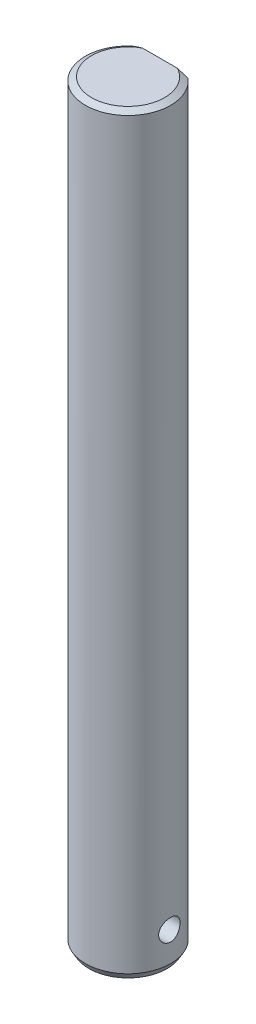
ISO-10303-21;
HEADER;
FILE_DESCRIPTION(('STEP AP214'),'2;1');
FILE_NAME('part.step','',(''),(''),'','','');
FILE_SCHEMA(('AUTOMOTIVE_DESIGN { 1 0 10303 214 1 1 1 1 }'));
ENDSEC;
DATA;
#1=APPLICATION_CONTEXT('core data for automotive mechanical design processes');
#2=APPLICATION_PROTOCOL_DEFINITION('international standard','automotive_design',2000,#1);
#3=PRODUCT_CONTEXT('',#1,'mechanical');
#4=PRODUCT('Part','Part','',(#3));
#5=PRODUCT_RELATED_PRODUCT_CATEGORY('part','',(#4));
#6=PRODUCT_DEFINITION_FORMATION('','',#4);
#7=PRODUCT_DEFINITION_CONTEXT('part definition',#1,'design');
#8=PRODUCT_DEFINITION('design','',#6,#7);
#9=PRODUCT_DEFINITION_SHAPE('','',#8);
#10=(LENGTH_UNIT() NAMED_UNIT(*) SI_UNIT(.MILLI.,.METRE.));
#11=(NAMED_UNIT(*) PLANE_ANGLE_UNIT() SI_UNIT($,.RADIAN.));
#12=(NAMED_UNIT(*) SI_UNIT($,.STERADIAN.) SOLID_ANGLE_UNIT());
#13=UNCERTAINTY_MEASURE_WITH_UNIT(LENGTH_MEASURE(1.E-05),#10,'distance_accuracy_value','');
#14=(GEOMETRIC_REPRESENTATION_CONTEXT(3) GLOBAL_UNCERTAINTY_ASSIGNED_CONTEXT((#13)) GLOBAL_UNIT_ASSIGNED_CONTEXT((#10,
#11,#12)) REPRESENTATION_CONTEXT('',''));
#15=CARTESIAN_POINT('',(0.,0.,0.));
#16=DIRECTION('',(0.,0.,1.));
#17=DIRECTION('',(1.,0.,0.));
#18=AXIS2_PLACEMENT_3D('',#15,#16,#17);
#19=CARTESIAN_POINT('',(0.,106.,0.));
#20=DIRECTION('',(0.,-1.,0.));
#21=DIRECTION('',(0.,0.,-1.));
#22=AXIS2_PLACEMENT_3D('',#19,#20,#21);
#23=CYLINDRICAL_SURFACE('',#22,6.);
#24=CARTESIAN_POINT('',(0.,0.866025403784401,0.));
#25=DIRECTION('',(0.,1.,0.));
#26=DIRECTION('',(0.,0.,1.));
#27=AXIS2_PLACEMENT_3D('',#24,#25,#26);
#28=CIRCLE('',#27,6.);
#29=CARTESIAN_POINT('',(0.,0.866025403784401,6.));
#30=VERTEX_POINT('',#29);
#31=EDGE_CURVE('E149',#30,#30,#28,.T.);
#32=ORIENTED_EDGE('',*,*,#31,.T.);
#33=EDGE_LOOP('',(#32));
#34=FACE_BOUND('',#33,.T.);
#35=CARTESIAN_POINT('',(-5.80947501931113,5.,-1.5));
#36=CARTESIAN_POINT('',(-5.80947660051185,5.08283045055477,-1.49999764715507));
#37=CARTESIAN_POINT('',(-5.81126583608348,5.1656869392068,-1.49311574729838));
#38=CARTESIAN_POINT('',(-5.81821117195949,5.32902054690442,-1.46581387527848));
#39=CARTESIAN_POINT('',(-5.82336923173088,5.409496252681,-1.44538602404532));
#40=CARTESIAN_POINT('',(-5.8364323475758,5.56568212291223,-1.39169471977917));
#41=CARTESIAN_POINT('',(-5.84433385614245,5.6413982932314,-1.35844783671268));
#42=CARTESIAN_POINT('',(-5.86198915217285,5.78618651152395,-1.28011268475684));
#43=CARTESIAN_POINT('',(-5.87174301827101,5.85525827724814,-1.23502391313641));
#44=CARTESIAN_POINT('',(-5.89224429813367,5.98631698715732,-1.13322505638712));
#45=CARTESIAN_POINT('',(-5.90300758573818,6.04813616021003,-1.07630213262243));
#46=CARTESIAN_POINT('',(-5.92417725309178,6.16145683661621,-0.952909238460398));
#47=CARTESIAN_POINT('',(-5.93458359939834,6.21295737537305,-0.886438376508184));
#48=CARTESIAN_POINT('',(-5.95404249312349,6.30486528057877,-0.744687120647372));
#49=CARTESIAN_POINT('',(-5.96307412440355,6.34510783289688,-0.669296745717072));
#50=CARTESIAN_POINT('',(-5.97858487155591,6.41228578649185,-0.512557910575657));
#51=CARTESIAN_POINT('',(-5.98506436400607,6.43922315114931,-0.431210331475164));
#52=CARTESIAN_POINT('',(-5.99462855308908,6.47848870074715,-0.266615255252496));
#53=CARTESIAN_POINT('',(-5.99777936306589,6.49110178659595,-0.183439631729384));
#54=CARTESIAN_POINT('',(-6.00056156464379,6.50225502756533,-0.0160972915576608));
#55=CARTESIAN_POINT('',(-6.00019347658022,6.50079726332576,0.0680692767228418));
#56=CARTESIAN_POINT('',(-5.99602856972121,6.48405508984991,0.233028370758582));
#57=CARTESIAN_POINT('',(-5.99230801404524,6.46907820496769,0.313854323401601));
#58=CARTESIAN_POINT('',(-5.98194501914912,6.4262172379709,0.47180737112053));
#59=CARTESIAN_POINT('',(-5.97530242439065,6.39833246877355,0.548934269055658));
#60=CARTESIAN_POINT('',(-5.95972505820537,6.33019845758776,0.69811005525271));
#61=CARTESIAN_POINT('',(-5.95077011817032,6.28983977320295,0.770106764649757));
#62=CARTESIAN_POINT('',(-5.9315394228579,6.19798659253025,0.906413433510733));
#63=CARTESIAN_POINT('',(-5.92126343791494,6.14649015886363,0.970722052628258));
#64=CARTESIAN_POINT('',(-5.90018228261712,6.03217475481057,1.09166105262743));
#65=CARTESIAN_POINT('',(-5.88937031715551,5.96908706459134,1.1480365186128));
#66=CARTESIAN_POINT('',(-5.86869026110024,5.83424001587585,1.24946456394453));
#67=CARTESIAN_POINT('',(-5.85882221463582,5.7624802523054,1.29451661406902));
#68=CARTESIAN_POINT('',(-5.84112298098989,5.61182597951062,1.3721821935339));
#69=CARTESIAN_POINT('',(-5.83330190235432,5.53289856181208,1.40473435045574));
#70=CARTESIAN_POINT('',(-5.82071184083974,5.37044871915413,1.45602843095451));
#71=CARTESIAN_POINT('',(-5.81594220486131,5.28692728161012,1.47477330982936));
#72=CARTESIAN_POINT('',(-5.81013213623485,5.12002429908613,1.49749778319911));
#73=CARTESIAN_POINT('',(-5.80899653456189,5.03669732400222,1.50185428435178));
#74=CARTESIAN_POINT('',(-5.81032406088624,4.8705068380531,1.49671019430933));
#75=CARTESIAN_POINT('',(-5.8127868576076,4.78764328522926,1.48721087870928));
#76=CARTESIAN_POINT('',(-5.82094249172736,4.62613144102718,1.4549552783626));
#77=CARTESIAN_POINT('',(-5.82658182140625,4.54743636405749,1.43241844096905));
#78=CARTESIAN_POINT('',(-5.84040430962578,4.39494112528899,1.37497084900237));
#79=CARTESIAN_POINT('',(-5.84858776949168,4.3211415445668,1.34005862862753));
#80=CARTESIAN_POINT('',(-5.86677682255958,4.17893523327959,1.25806240076193));
#81=CARTESIAN_POINT('',(-5.87681501163985,4.11066269597414,1.21075305230138));
#82=CARTESIAN_POINT('',(-5.8975024984303,3.98288698231919,1.10559043940168));
#83=CARTESIAN_POINT('',(-5.90815189637082,3.92338525000996,1.04773544220816));
#84=CARTESIAN_POINT('',(-5.92918441818964,3.81331337445743,0.921394081477088));
#85=CARTESIAN_POINT('',(-5.93955421237102,3.76300396247071,0.852677928797388));
#86=CARTESIAN_POINT('',(-5.95858329968241,3.67463847982925,0.707554024042012));
#87=CARTESIAN_POINT('',(-5.96724268202376,3.63658177003508,0.631146673436386));
#88=CARTESIAN_POINT('',(-5.98182069442989,3.57413237928324,0.473337302596634));
#89=CARTESIAN_POINT('',(-5.98775898013446,3.54964142937256,0.391976071541821));
#90=CARTESIAN_POINT('',(-5.99631176037473,3.51472379923495,0.226124640478211));
#91=CARTESIAN_POINT('',(-5.99892689636045,3.50429440475657,0.141635047561865));
#92=CARTESIAN_POINT('',(-6.00051254113217,3.4979486156367,-0.0256252896649903));
#93=CARTESIAN_POINT('',(-5.99957968320012,3.50164743635692,-0.10838074044905));
#94=CARTESIAN_POINT('',(-5.99438844686135,3.5225717409415,-0.27205124462211));
#95=CARTESIAN_POINT('',(-5.99013016735643,3.53979682251966,-0.35296635267133));
#96=CARTESIAN_POINT('',(-5.97878149280944,3.58707832965639,-0.510256553467225));
#97=CARTESIAN_POINT('',(-5.97170646753999,3.61706517997194,-0.586653741871529));
#98=CARTESIAN_POINT('',(-5.95546933370076,3.68895586852899,-0.733375579562203));
#99=CARTESIAN_POINT('',(-5.94630696206604,3.73086120900435,-0.803699461897577));
#100=CARTESIAN_POINT('',(-5.92660874521999,3.82657285099561,-0.938102892635849));
#101=CARTESIAN_POINT('',(-5.91604525418417,3.88064021436107,-1.00199248245088));
#102=CARTESIAN_POINT('',(-5.89485973579863,3.9986342779607,-1.11992253040688));
#103=CARTESIAN_POINT('',(-5.88423769428834,4.06256347414686,-1.17396048760228));
#104=CARTESIAN_POINT('',(-5.86391213790822,4.199902121302,-1.27164303971884));
#105=CARTESIAN_POINT('',(-5.85422945594827,4.27346618511894,-1.31507492916982));
#106=CARTESIAN_POINT('',(-5.83715933325924,4.42708323488405,-1.3888903449235));
#107=CARTESIAN_POINT('',(-5.82977022370054,4.50713144916011,-1.41928336463958));
#108=CARTESIAN_POINT('',(-5.81927863109675,4.65586551774008,-1.46163379284816));
#109=CARTESIAN_POINT('',(-5.8156299450082,4.72383974657579,-1.47598975589307));
#110=CARTESIAN_POINT('',(-5.81072757878358,4.86120330349995,-1.4951734388599));
#111=CARTESIAN_POINT('',(-5.80947369434945,4.93059251036759,-1.50000197155828));
#112=CARTESIAN_POINT('',(-5.80947501931113,5.,-1.5));
#113=B_SPLINE_CURVE_WITH_KNOTS('',3,(#35,#36,#37,#38,#39,#40,#41,#42,#43,#44,#45,#46,#47,#48,
#49,#50,#51,#52,#53,#54,#55,#56,#57,#58,#59,#60,#61,#62,#63,#64,#65,#66,#67,#68,#69,#70,#71,#72,
#73,#74,#75,#76,#77,#78,#79,#80,#81,#82,#83,#84,#85,#86,#87,#88,#89,#90,#91,#92,#93,#94,#95,#96,
#97,#98,#99,#100,#101,#102,#103,#104,#105,#106,#107,#108,#109,#110,#111,#112),.UNSPECIFIED.,.T.,
.F.,(4,2,2,2,2,2,2,2,2,2,2,2,2,2,2,2,2,2,2,2,2,2,2,2,2,2,2,2,2,2,2,2,2,2,2,2,2,2,4),(0.,
0.248236465041681,0.4966174448572,0.744678436299612,0.99274996053287,1.24574372515786,
1.4987611288792,1.75530897838752,2.01181895908255,2.26313250597208,2.51440889199612,
2.76010957613368,3.00582334034872,3.25375724552667,3.50173431281348,3.75642279943147,
4.01112318719881,4.26705859205041,4.52293920077728,4.7720614485703,5.02116076310281,
5.26618443005524,5.5112371285285,5.76109707515494,6.01099811331027,6.26715198579191,
6.52329249431732,6.77755243684157,7.03176329345423,7.27910067676474,7.52643070426188,
7.77242925935826,8.01845883442843,8.27038257949242,8.52237018939305,8.77905886370806,
9.03556032819971,9.24358696306398,9.45159585059712),.UNSPECIFIED.);
#114=CARTESIAN_POINT('',(-5.80947501931113,5.,-1.5));
#115=VERTEX_POINT('',#114);
#116=EDGE_CURVE('E97',#115,#115,#113,.T.);
#117=ORIENTED_EDGE('',*,*,#116,.T.);
#118=EDGE_LOOP('',(#117));
#119=FACE_BOUND('',#118,.T.);
#120=CARTESIAN_POINT('',(5.80947501931113,5.,-1.5));
#121=CARTESIAN_POINT('',(5.80947660051185,4.91716954944524,-1.49999764715507));
#122=CARTESIAN_POINT('',(5.81126583608348,4.8343130607932,-1.49311574729838));
#123=CARTESIAN_POINT('',(5.81821117195949,4.67097945309558,-1.46581387527848));
#124=CARTESIAN_POINT('',(5.82336923173088,4.59050374731901,-1.44538602404532));
#125=CARTESIAN_POINT('',(5.8364323475758,4.43431787708778,-1.39169471977917));
#126=CARTESIAN_POINT('',(5.84433385614245,4.3586017067686,-1.35844783671268));
#127=CARTESIAN_POINT('',(5.86198915217285,4.21381348847605,-1.28011268475684));
#128=CARTESIAN_POINT('',(5.87174301827101,4.14474172275187,-1.23502391313641));
#129=CARTESIAN_POINT('',(5.89224429813367,4.01368301284268,-1.13322505638712));
#130=CARTESIAN_POINT('',(5.90300758573818,3.95186383978997,-1.07630213262243));
#131=CARTESIAN_POINT('',(5.92417725309178,3.8385431633838,-0.952909238460398));
#132=CARTESIAN_POINT('',(5.93458359939834,3.78704262462695,-0.886438376508184));
#133=CARTESIAN_POINT('',(5.95404249312349,3.69513471942124,-0.744687120647372));
#134=CARTESIAN_POINT('',(5.96307412440355,3.65489216710312,-0.669296745717071));
#135=CARTESIAN_POINT('',(5.97858487155591,3.58771421350815,-0.512557910575657));
#136=CARTESIAN_POINT('',(5.98506436400607,3.56077684885069,-0.431210331475163));
#137=CARTESIAN_POINT('',(5.99462855308908,3.52151129925285,-0.266615255252496));
#138=CARTESIAN_POINT('',(5.99777936306589,3.50889821340405,-0.183439631729384));
#139=CARTESIAN_POINT('',(6.00056156464379,3.49774497243467,-0.0160972915576607));
#140=CARTESIAN_POINT('',(6.00019347658022,3.49920273667424,0.0680692767228419));
#141=CARTESIAN_POINT('',(5.99602856972121,3.51594491015009,0.233028370758582));
#142=CARTESIAN_POINT('',(5.99230801404524,3.53092179503232,0.313854323401601));
#143=CARTESIAN_POINT('',(5.98194501914912,3.5737827620291,0.47180737112053));
#144=CARTESIAN_POINT('',(5.97530242439065,3.60166753122645,0.548934269055658));
#145=CARTESIAN_POINT('',(5.95972505820537,3.66980154241224,0.698110055252711));
#146=CARTESIAN_POINT('',(5.95077011817032,3.71016022679705,0.770106764649758));
#147=CARTESIAN_POINT('',(5.9315394228579,3.80201340746976,0.906413433510734));
#148=CARTESIAN_POINT('',(5.92126343791494,3.85350984113637,0.970722052628259));
#149=CARTESIAN_POINT('',(5.90018228261712,3.96782524518943,1.09166105262743));
#150=CARTESIAN_POINT('',(5.88937031715551,4.03091293540867,1.1480365186128));
#151=CARTESIAN_POINT('',(5.86869026110024,4.16575998412415,1.24946456394453));
#152=CARTESIAN_POINT('',(5.85882221463582,4.2375197476946,1.29451661406902));
#153=CARTESIAN_POINT('',(5.84112298098989,4.38817402048938,1.3721821935339));
#154=CARTESIAN_POINT('',(5.83330190235432,4.46710143818792,1.40473435045574));
#155=CARTESIAN_POINT('',(5.82071184083974,4.62955128084587,1.45602843095451));
#156=CARTESIAN_POINT('',(5.81594220486131,4.71307271838988,1.47477330982936));
#157=CARTESIAN_POINT('',(5.81013213623485,4.87997570091387,1.49749778319911));
#158=CARTESIAN_POINT('',(5.80899653456189,4.96330267599778,1.50185428435178));
#159=CARTESIAN_POINT('',(5.81032406088624,5.1294931619469,1.49671019430933));
#160=CARTESIAN_POINT('',(5.8127868576076,5.21235671477075,1.48721087870928));
#161=CARTESIAN_POINT('',(5.82094249172736,5.37386855897283,1.4549552783626));
#162=CARTESIAN_POINT('',(5.82658182140625,5.45256363594251,1.43241844096905));
#163=CARTESIAN_POINT('',(5.84040430962578,5.60505887471101,1.37497084900237));
#164=CARTESIAN_POINT('',(5.84858776949168,5.6788584554332,1.34005862862753));
#165=CARTESIAN_POINT('',(5.86677682255958,5.82106476672041,1.25806240076193));
#166=CARTESIAN_POINT('',(5.87681501163985,5.88933730402586,1.21075305230138));
#167=CARTESIAN_POINT('',(5.8975024984303,6.01711301768081,1.10559043940168));
#168=CARTESIAN_POINT('',(5.90815189637082,6.07661474999005,1.04773544220816));
#169=CARTESIAN_POINT('',(5.92918441818964,6.18668662554258,0.921394081477088));
#170=CARTESIAN_POINT('',(5.93955421237102,6.23699603752929,0.852677928797388));
#171=CARTESIAN_POINT('',(5.95858329968241,6.32536152017075,0.707554024042012));
#172=CARTESIAN_POINT('',(5.96724268202376,6.36341822996493,0.631146673436385));
#173=CARTESIAN_POINT('',(5.98182069442989,6.42586762071676,0.473337302596634));
#174=CARTESIAN_POINT('',(5.98775898013446,6.45035857062744,0.391976071541821));
#175=CARTESIAN_POINT('',(5.99631176037473,6.48527620076505,0.226124640478211));
#176=CARTESIAN_POINT('',(5.99892689636045,6.49570559524343,0.141635047561865));
#177=CARTESIAN_POINT('',(6.00051254113217,6.5020513843633,-0.0256252896649898));
#178=CARTESIAN_POINT('',(5.99957968320012,6.49835256364309,-0.10838074044905));
#179=CARTESIAN_POINT('',(5.99438844686135,6.4774282590585,-0.27205124462211));
#180=CARTESIAN_POINT('',(5.99013016735643,6.46020317748035,-0.35296635267133));
#181=CARTESIAN_POINT('',(5.97878149280944,6.41292167034361,-0.510256553467224));
#182=CARTESIAN_POINT('',(5.97170646753999,6.38293482002806,-0.586653741871529));
#183=CARTESIAN_POINT('',(5.95546933370076,6.31104413147101,-0.733375579562203));
#184=CARTESIAN_POINT('',(5.94630696206604,6.26913879099565,-0.803699461897577));
#185=CARTESIAN_POINT('',(5.92660874521999,6.17342714900439,-0.938102892635849));
#186=CARTESIAN_POINT('',(5.91604525418417,6.11935978563893,-1.00199248245088));
#187=CARTESIAN_POINT('',(5.89485973579863,6.0013657220393,-1.11992253040688));
#188=CARTESIAN_POINT('',(5.88423769428834,5.93743652585314,-1.17396048760228));
#189=CARTESIAN_POINT('',(5.86391213790822,5.800097878698,-1.27164303971884));
#190=CARTESIAN_POINT('',(5.85422945594827,5.72653381488106,-1.31507492916982));
#191=CARTESIAN_POINT('',(5.83715933325924,5.57291676511595,-1.3888903449235));
#192=CARTESIAN_POINT('',(5.82977022370054,5.49286855083989,-1.41928336463958));
#193=CARTESIAN_POINT('',(5.81927863109675,5.34413448225993,-1.46163379284816));
#194=CARTESIAN_POINT('',(5.8156299450082,5.27616025342421,-1.47598975589307));
#195=CARTESIAN_POINT('',(5.81072757878358,5.13879669650006,-1.4951734388599));
#196=CARTESIAN_POINT('',(5.80947369434945,5.06940748963241,-1.50000197155828));
#197=CARTESIAN_POINT('',(5.80947501931113,5.,-1.5));
#198=B_SPLINE_CURVE_WITH_KNOTS('',3,(#120,#121,#122,#123,#124,#125,#126,#127,#128,#129,#130,
#131,#132,#133,#134,#135,#136,#137,#138,#139,#140,#141,#142,#143,#144,#145,#146,#147,#148,#149,
#150,#151,#152,#153,#154,#155,#156,#157,#158,#159,#160,#161,#162,#163,#164,#165,#166,#167,#168,
#169,#170,#171,#172,#173,#174,#175,#176,#177,#178,#179,#180,#181,#182,#183,#184,#185,#186,#187,
#188,#189,#190,#191,#192,#193,#194,#195,#196,#197),.UNSPECIFIED.,.T.,.F.,(4,2,2,2,2,2,2,2,2,2,2,
2,2,2,2,2,2,2,2,2,2,2,2,2,2,2,2,2,2,2,2,2,2,2,2,2,2,2,4),(0.,0.248236465041681,0.4966174448572,
0.744678436299613,0.99274996053287,1.24574372515786,1.4987611288792,1.75530897838752,
2.01181895908255,2.26313250597208,2.51440889199612,2.76010957613368,3.00582334034872,
3.25375724552667,3.50173431281348,3.75642279943147,4.01112318719881,4.26705859205041,
4.52293920077728,4.7720614485703,5.02116076310281,5.26618443005524,5.5112371285285,
5.76109707515494,6.01099811331027,6.26715198579191,6.52329249431732,6.77755243684157,
7.03176329345423,7.27910067676474,7.52643070426188,7.77242925935826,8.01845883442843,
8.27038257949242,8.52237018939305,8.77905886370806,9.03556032819971,9.24358696306398,
9.45159585059712),.UNSPECIFIED.);
#199=CARTESIAN_POINT('',(5.80947501931113,5.,-1.5));
#200=VERTEX_POINT('',#199);
#201=EDGE_CURVE('E103',#200,#200,#198,.T.);
#202=ORIENTED_EDGE('',*,*,#201,.T.);
#203=EDGE_LOOP('',(#202));
#204=FACE_BOUND('',#203,.T.);
#205=DIRECTION('',(0.,-1.,0.));
#206=VECTOR('',#205,1.);
#207=CARTESIAN_POINT('',(3.96862696659689,106.,-4.5));
#208=LINE('',#207,#206);
#209=CARTESIAN_POINT('',(3.96862696659689,96.,-4.5));
#210=VERTEX_POINT('',#209);
#211=CARTESIAN_POINT('',(3.96862696659689,105.5,-4.5));
#212=VERTEX_POINT('',#211);
#213=EDGE_CURVE('E86',#210,#212,#208,.F.);
#214=ORIENTED_EDGE('',*,*,#213,.T.);
#215=CARTESIAN_POINT('',(0.,105.5,0.));
#216=DIRECTION('',(0.,1.,0.));
#217=DIRECTION('',(0.,0.,1.));
#218=AXIS2_PLACEMENT_3D('',#215,#216,#217);
#219=CIRCLE('',#218,6.);
#220=CARTESIAN_POINT('',(-3.96862696659689,105.5,-4.5));
#221=VERTEX_POINT('',#220);
#222=EDGE_CURVE('E55',#212,#221,#219,.F.);
#223=ORIENTED_EDGE('',*,*,#222,.T.);
#224=DIRECTION('',(0.,-1.,0.));
#225=VECTOR('',#224,1.);
#226=CARTESIAN_POINT('',(-3.96862696659689,106.,-4.5));
#227=LINE('',#226,#225);
#228=CARTESIAN_POINT('',(-3.96862696659689,96.,-4.5));
#229=VERTEX_POINT('',#228);
#230=EDGE_CURVE('E79',#221,#229,#227,.T.);
#231=ORIENTED_EDGE('',*,*,#230,.T.);
#232=CARTESIAN_POINT('',(0.,96.,0.));
#233=DIRECTION('',(0.,1.,0.));
#234=DIRECTION('',(0.,0.,1.));
#235=AXIS2_PLACEMENT_3D('',#232,#233,#234);
#236=CIRCLE('',#235,6.);
#237=EDGE_CURVE('E81',#210,#229,#236,.T.);
#238=ORIENTED_EDGE('',*,*,#237,.F.);
#239=EDGE_LOOP('',(#214,#223,#231,#238));
#240=FACE_BOUND('',#239,.T.);
#241=ADVANCED_FACE('F45',(#34,#119,#204,#240),#23,.T.);
#242=CARTESIAN_POINT('',(0.,106.,0.));
#243=DIRECTION('',(0.,1.,0.));
#244=DIRECTION('',(0.,0.,1.));
#245=AXIS2_PLACEMENT_3D('',#242,#243,#244);
#246=PLANE('',#245);
#247=DIRECTION('',(1.,0.,0.));
#248=VECTOR('',#247,1.);
#249=CARTESIAN_POINT('',(0.,106.,-4.5));
#250=LINE('',#249,#248);
#251=CARTESIAN_POINT('',(-2.47137515456208,106.,-4.5));
#252=VERTEX_POINT('',#251);
#253=CARTESIAN_POINT('',(2.47137515456208,106.,-4.5));
#254=VERTEX_POINT('',#253);
#255=EDGE_CURVE('E85',#252,#254,#250,.T.);
#256=ORIENTED_EDGE('',*,*,#255,.F.);
#257=CARTESIAN_POINT('',(0.,106.,0.));
#258=DIRECTION('',(0.,1.,0.));
#259=DIRECTION('',(0.,0.,1.));
#260=AXIS2_PLACEMENT_3D('',#257,#258,#259);
#261=CIRCLE('',#260,5.13397459621556);
#262=EDGE_CURVE('E93',#252,#254,#261,.T.);
#263=ORIENTED_EDGE('',*,*,#262,.T.);
#264=EDGE_LOOP('',(#256,#263));
#265=FACE_BOUND('',#264,.T.);
#266=ADVANCED_FACE('F134',(#265),#246,.T.);
#267=CARTESIAN_POINT('',(0.,0.,0.));
#268=DIRECTION('',(0.,1.,0.));
#269=DIRECTION('',(0.,0.,1.));
#270=AXIS2_PLACEMENT_3D('',#267,#268,#269);
#271=PLANE('',#270);
#272=CARTESIAN_POINT('',(0.,0.,0.));
#273=DIRECTION('',(0.,1.,0.));
#274=DIRECTION('',(0.,0.,1.));
#275=AXIS2_PLACEMENT_3D('',#272,#273,#274);
#276=CIRCLE('',#275,5.50000000000003);
#277=CARTESIAN_POINT('',(0.,0.,5.50000000000003));
#278=VERTEX_POINT('',#277);
#279=EDGE_CURVE('E11',#278,#278,#276,.F.);
#280=ORIENTED_EDGE('',*,*,#279,.T.);
#281=EDGE_LOOP('',(#280));
#282=FACE_BOUND('',#281,.T.);
#283=ADVANCED_FACE('F130',(#282),#271,.F.);
#284=CARTESIAN_POINT('',(0.,96.,0.));
#285=DIRECTION('',(0.,1.,0.));
#286=DIRECTION('',(0.,0.,1.));
#287=AXIS2_PLACEMENT_3D('',#284,#285,#286);
#288=PLANE('',#287);
#289=ORIENTED_EDGE('',*,*,#237,.T.);
#290=DIRECTION('',(1.,0.,0.));
#291=VECTOR('',#290,1.);
#292=CARTESIAN_POINT('',(-5.40128068303095,96.,-4.5));
#293=LINE('',#292,#291);
#294=EDGE_CURVE('E91',#229,#210,#293,.T.);
#295=ORIENTED_EDGE('',*,*,#294,.T.);
#296=EDGE_LOOP('',(#289,#295));
#297=FACE_BOUND('',#296,.T.);
#298=ADVANCED_FACE('F90',(#297),#288,.T.);
#299=CARTESIAN_POINT('',(-5.40128068303095,96.,-4.5));
#300=DIRECTION('',(0.,0.,1.));
#301=DIRECTION('',(1.,0.,0.));
#302=AXIS2_PLACEMENT_3D('',#299,#300,#301);
#303=PLANE('',#302);
#304=ORIENTED_EDGE('',*,*,#255,.T.);
#305=CARTESIAN_POINT('',(2.47137515456208,106.,-4.5));
#306=CARTESIAN_POINT('',(2.59821029234091,105.964741067028,-4.5));
#307=CARTESIAN_POINT('',(2.72449842776643,105.927566203446,-4.5));
#308=CARTESIAN_POINT('',(2.97597185015973,105.849882020878,-4.5));
#309=CARTESIAN_POINT('',(3.10115769990573,105.809374527543,-4.5));
#310=CARTESIAN_POINT('',(3.35054029678143,105.725488234176,-4.5));
#311=CARTESIAN_POINT('',(3.47473716361617,105.682109787745,-4.5));
#312=CARTESIAN_POINT('',(3.72230196848673,105.592839293428,-4.5));
#313=CARTESIAN_POINT('',(3.84566941885811,105.54694589105,-4.5));
#314=CARTESIAN_POINT('',(3.96862696659689,105.5,-4.5));
#315=B_SPLINE_CURVE_WITH_KNOTS('',3,(#305,#306,#307,#308,#309,#310,#311,#312,#313,#314),
.UNSPECIFIED.,.F.,.F.,(4,2,2,2,4),(0.,0.394899349737702,0.789583791657925,1.18421971236831,
1.57907030390004),.UNSPECIFIED.);
#316=EDGE_CURVE('E69',#254,#212,#315,.T.);
#317=ORIENTED_EDGE('',*,*,#316,.T.);
#318=ORIENTED_EDGE('',*,*,#213,.F.);
#319=ORIENTED_EDGE('',*,*,#294,.F.);
#320=ORIENTED_EDGE('',*,*,#230,.F.);
#321=CARTESIAN_POINT('',(-3.96862696659689,105.5,-4.5));
#322=CARTESIAN_POINT('',(-3.84566941885811,105.54694589105,-4.5));
#323=CARTESIAN_POINT('',(-3.72230196848673,105.592839293428,-4.5));
#324=CARTESIAN_POINT('',(-3.47473716361617,105.682109787745,-4.5));
#325=CARTESIAN_POINT('',(-3.35054029678143,105.725488234176,-4.5));
#326=CARTESIAN_POINT('',(-3.10115769990573,105.809374527543,-4.5));
#327=CARTESIAN_POINT('',(-2.97597185015973,105.849882020878,-4.5));
#328=CARTESIAN_POINT('',(-2.72449842776643,105.927566203446,-4.5));
#329=CARTESIAN_POINT('',(-2.59821029234091,105.964741067028,-4.5));
#330=CARTESIAN_POINT('',(-2.47137515456208,106.,-4.5));
#331=B_SPLINE_CURVE_WITH_KNOTS('',3,(#321,#322,#323,#324,#325,#326,#327,#328,#329,#330),
.UNSPECIFIED.,.F.,.F.,(4,2,2,2,4),(0.,0.394850591531729,0.789486512242111,1.18417095416234,
1.57907030390004),.UNSPECIFIED.);
#332=EDGE_CURVE('E137',#221,#252,#331,.T.);
#333=ORIENTED_EDGE('',*,*,#332,.T.);
#334=EDGE_LOOP('',(#304,#317,#318,#319,#320,#333));
#335=FACE_BOUND('',#334,.T.);
#336=ADVANCED_FACE('F95',(#335),#303,.F.);
#337=CARTESIAN_POINT('',(-20.,5.,0.));
#338=DIRECTION('',(1.,0.,0.));
#339=DIRECTION('',(0.,0.,-1.));
#340=AXIS2_PLACEMENT_3D('',#337,#338,#339);
#341=CYLINDRICAL_SURFACE('',#340,1.5);
#342=ORIENTED_EDGE('',*,*,#201,.F.);
#343=EDGE_LOOP('',(#342));
#344=FACE_BOUND('',#343,.T.);
#345=ORIENTED_EDGE('',*,*,#116,.F.);
#346=EDGE_LOOP('',(#345));
#347=FACE_BOUND('',#346,.T.);
#348=ADVANCED_FACE('F121',(#344,#347),#341,.F.);
#349=CARTESIAN_POINT('',(0.,106.,0.));
#350=DIRECTION('',(0.,-1.,0.));
#351=DIRECTION('',(0.,0.,-1.));
#352=AXIS2_PLACEMENT_3D('',#349,#350,#351);
#353=CONICAL_SURFACE('',#352,5.13397459621556,1.04719755119659);
#354=ORIENTED_EDGE('',*,*,#332,.F.);
#355=ORIENTED_EDGE('',*,*,#222,.F.);
#356=ORIENTED_EDGE('',*,*,#316,.F.);
#357=ORIENTED_EDGE('',*,*,#262,.F.);
#358=EDGE_LOOP('',(#354,#355,#356,#357));
#359=FACE_BOUND('',#358,.T.);
#360=ADVANCED_FACE('F125',(#359),#353,.T.);
#361=CARTESIAN_POINT('',(0.,0.866025403784401,0.));
#362=DIRECTION('',(0.,1.,0.));
#363=DIRECTION('',(0.,0.,1.));
#364=AXIS2_PLACEMENT_3D('',#361,#362,#363);
#365=CONICAL_SURFACE('',#364,6.,0.523598775598296);
#366=CARTESIAN_POINT('',(0.,0.,5.50000000000003));
#367=CARTESIAN_POINT('',(0.,0.00902109795608741,5.50520833333336));
#368=CARTESIAN_POINT('',(0.,0.0180421959121749,5.51041666666669));
#369=CARTESIAN_POINT('',(0.,0.0360843918243499,5.52083333333336));
#370=CARTESIAN_POINT('',(0.,0.0451054897804374,5.52604166666669));
#371=CARTESIAN_POINT('',(0.,0.0631476856926125,5.53645833333336));
#372=CARTESIAN_POINT('',(0.,0.0721687836487,5.54166666666669));
#373=CARTESIAN_POINT('',(0.,0.090210979560875,5.55208333333336));
#374=CARTESIAN_POINT('',(0.,0.0992320775169625,5.55729166666669));
#375=CARTESIAN_POINT('',(0.,0.117274273429138,5.56770833333336));
#376=CARTESIAN_POINT('',(0.,0.126295371385225,5.57291666666669));
#377=CARTESIAN_POINT('',(0.,0.1443375672974,5.58333333333335));
#378=CARTESIAN_POINT('',(0.,0.153358665253488,5.58854166666669));
#379=CARTESIAN_POINT('',(0.,0.171400861165663,5.59895833333335));
#380=CARTESIAN_POINT('',(0.,0.18042195912175,5.60416666666669));
#381=CARTESIAN_POINT('',(0.,0.198464155033925,5.61458333333335));
#382=CARTESIAN_POINT('',(0.,0.207485252990013,5.61979166666669));
#383=CARTESIAN_POINT('',(0.,0.225527448902188,5.63020833333335));
#384=CARTESIAN_POINT('',(0.,0.234548546858275,5.63541666666669));
#385=CARTESIAN_POINT('',(0.,0.25259074277045,5.64583333333335));
#386=CARTESIAN_POINT('',(0.,0.261611840726538,5.65104166666669));
#387=CARTESIAN_POINT('',(0.,0.279654036638713,5.66145833333335));
#388=CARTESIAN_POINT('',(0.,0.2886751345948,5.66666666666668));
#389=CARTESIAN_POINT('',(0.,0.306717330506975,5.67708333333335));
#390=CARTESIAN_POINT('',(0.,0.315738428463063,5.68229166666668));
#391=CARTESIAN_POINT('',(0.,0.333780624375238,5.69270833333335));
#392=CARTESIAN_POINT('',(0.,0.342801722331325,5.69791666666668));
#393=CARTESIAN_POINT('',(0.,0.3608439182435,5.70833333333335));
#394=CARTESIAN_POINT('',(0.,0.369865016199588,5.71354166666668));
#395=CARTESIAN_POINT('',(0.,0.387907212111763,5.72395833333335));
#396=CARTESIAN_POINT('',(0.,0.39692831006785,5.72916666666668));
#397=CARTESIAN_POINT('',(0.,0.414970505980026,5.73958333333335));
#398=CARTESIAN_POINT('',(0.,0.423991603936113,5.74479166666668));
#399=CARTESIAN_POINT('',(0.,0.442033799848288,5.75520833333335));
#400=CARTESIAN_POINT('',(0.,0.451054897804375,5.76041666666668));
#401=CARTESIAN_POINT('',(0.,0.469097093716551,5.77083333333335));
#402=CARTESIAN_POINT('',(0.,0.478118191672638,5.77604166666668));
#403=CARTESIAN_POINT('',(0.,0.496160387584813,5.78645833333334));
#404=CARTESIAN_POINT('',(0.,0.505181485540901,5.79166666666668));
#405=CARTESIAN_POINT('',(0.,0.523223681453076,5.80208333333334));
#406=CARTESIAN_POINT('',(0.,0.532244779409163,5.80729166666668));
#407=CARTESIAN_POINT('',(0.,0.550286975321338,5.81770833333334));
#408=CARTESIAN_POINT('',(0.,0.559308073277426,5.82291666666668));
#409=CARTESIAN_POINT('',(0.,0.577350269189601,5.83333333333334));
#410=CARTESIAN_POINT('',(0.,0.586371367145688,5.83854166666668));
#411=CARTESIAN_POINT('',(0.,0.604413563057863,5.84895833333334));
#412=CARTESIAN_POINT('',(0.,0.613434661013951,5.85416666666667));
#413=CARTESIAN_POINT('',(0.,0.631476856926126,5.86458333333334));
#414=CARTESIAN_POINT('',(0.,0.640497954882213,5.86979166666667));
#415=CARTESIAN_POINT('',(0.,0.658540150794388,5.88020833333334));
#416=CARTESIAN_POINT('',(0.,0.667561248750476,5.88541666666667));
#417=CARTESIAN_POINT('',(0.,0.685603444662651,5.89583333333334));
#418=CARTESIAN_POINT('',(0.,0.694624542618739,5.90104166666667));
#419=CARTESIAN_POINT('',(0.,0.712666738530914,5.91145833333334));
#420=CARTESIAN_POINT('',(0.,0.721687836487001,5.91666666666667));
#421=CARTESIAN_POINT('',(0.,0.739730032399176,5.92708333333334));
#422=CARTESIAN_POINT('',(0.,0.748751130355263,5.93229166666667));
#423=CARTESIAN_POINT('',(0.,0.766793326267439,5.94270833333334));
#424=CARTESIAN_POINT('',(0.,0.775814424223526,5.94791666666667));
#425=CARTESIAN_POINT('',(0.,0.793856620135701,5.95833333333334));
#426=CARTESIAN_POINT('',(0.,0.802877718091789,5.96354166666667));
#427=CARTESIAN_POINT('',(0.,0.820919914003964,5.97395833333334));
#428=CARTESIAN_POINT('',(0.,0.829941011960051,5.97916666666667));
#429=CARTESIAN_POINT('',(0.,0.847983207872226,5.98958333333333));
#430=CARTESIAN_POINT('',(0.,0.857004305828314,5.99479166666667));
#431=CARTESIAN_POINT('',(0.,0.866025403784401,6.));
#432=B_SPLINE_CURVE_WITH_KNOTS('',3,(#366,#367,#368,#369,#370,#371,#372,#373,#374,#375,#376,
#377,#378,#379,#380,#381,#382,#383,#384,#385,#386,#387,#388,#389,#390,#391,#392,#393,#394,#395,
#396,#397,#398,#399,#400,#401,#402,#403,#404,#405,#406,#407,#408,#409,#410,#411,#412,#413,#414,
#415,#416,#417,#418,#419,#420,#421,#422,#423,#424,#425,#426,#427,#428,#429,#430,#431),
.UNSPECIFIED.,.F.,.F.,(4,2,2,2,2,2,2,2,2,2,2,2,2,2,2,2,2,2,2,2,2,2,2,2,2,2,2,2,2,2,2,2,4),(0.,
0.0312499999999986,0.0624999999999971,0.0937499999999957,0.124999999999994,0.156249999999993,
0.187499999999991,0.21874999999999,0.249999999999989,0.281249999999987,0.312499999999986,
0.343749999999985,0.374999999999983,0.406249999999982,0.43749999999998,0.468749999999979,
0.499999999999977,0.531249999999976,0.562499999999975,0.593749999999974,0.624999999999972,
0.656249999999971,0.687499999999969,0.718749999999968,0.749999999999966,0.781249999999965,
0.812499999999963,0.843749999999962,0.874999999999961,0.906249999999959,0.937499999999958,
0.968749999999956,0.999999999999955),.UNSPECIFIED.);
#433=EDGE_CURVE('BSEAM48',#278,#30,#432,.T.);
#434=ORIENTED_EDGE('',*,*,#279,.F.);
#435=ORIENTED_EDGE('',*,*,#31,.F.);
#436=ORIENTED_EDGE('',*,*,#433,.T.);
#437=ORIENTED_EDGE('',*,*,#433,.F.);
#438=EDGE_LOOP('',(#434,#436,#435,#437));
#439=FACE_BOUND('',#438,.T.);
#440=ADVANCED_FACE('F48',(#439),#365,.T.);
#441=CLOSED_SHELL('',(#241,#266,#283,#298,#336,#348,#360,#440));
#442=MANIFOLD_SOLID_BREP('B2',#441);
#443=ADVANCED_BREP_SHAPE_REPRESENTATION('',(#18,#442),#14);
#444=SHAPE_DEFINITION_REPRESENTATION(#9,#443);
ENDSEC;
END-ISO-10303-21;
